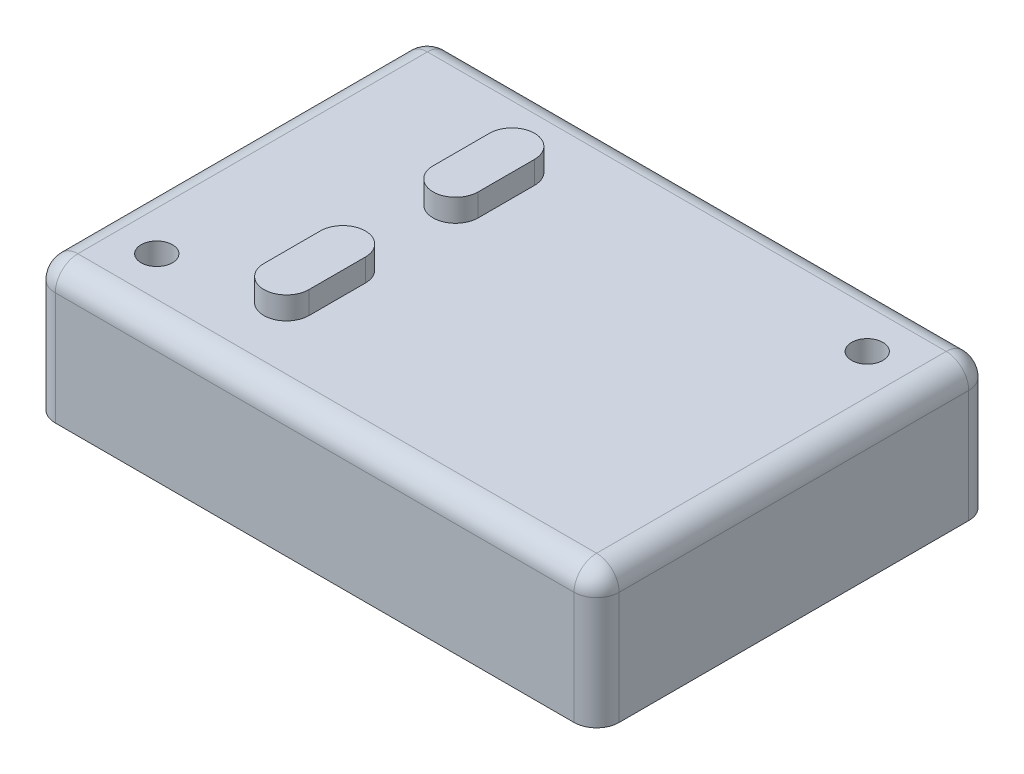
ISO-10303-21;
HEADER;
FILE_DESCRIPTION(('STEP AP214'),'2;1');
FILE_NAME('part.step','',(''),(''),'','','');
FILE_SCHEMA(('AUTOMOTIVE_DESIGN { 1 0 10303 214 1 1 1 1 }'));
ENDSEC;
DATA;
#1=APPLICATION_CONTEXT('core data for automotive mechanical design processes');
#2=APPLICATION_PROTOCOL_DEFINITION('international standard','automotive_design',2000,#1);
#3=PRODUCT_CONTEXT('',#1,'mechanical');
#4=PRODUCT('Part','Part','',(#3));
#5=PRODUCT_RELATED_PRODUCT_CATEGORY('part','',(#4));
#6=PRODUCT_DEFINITION_FORMATION('','',#4);
#7=PRODUCT_DEFINITION_CONTEXT('part definition',#1,'design');
#8=PRODUCT_DEFINITION('design','',#6,#7);
#9=PRODUCT_DEFINITION_SHAPE('','',#8);
#10=(LENGTH_UNIT() NAMED_UNIT(*) SI_UNIT(.MILLI.,.METRE.));
#11=(NAMED_UNIT(*) PLANE_ANGLE_UNIT() SI_UNIT($,.RADIAN.));
#12=(NAMED_UNIT(*) SI_UNIT($,.STERADIAN.) SOLID_ANGLE_UNIT());
#13=UNCERTAINTY_MEASURE_WITH_UNIT(LENGTH_MEASURE(1.E-05),#10,'distance_accuracy_value','');
#14=(GEOMETRIC_REPRESENTATION_CONTEXT(3) GLOBAL_UNCERTAINTY_ASSIGNED_CONTEXT((#13)) GLOBAL_UNIT_ASSIGNED_CONTEXT((#10,
#11,#12)) REPRESENTATION_CONTEXT('',''));
#15=CARTESIAN_POINT('',(0.,0.,0.));
#16=DIRECTION('',(0.,0.,1.));
#17=DIRECTION('',(1.,0.,0.));
#18=AXIS2_PLACEMENT_3D('',#15,#16,#17);
#19=CARTESIAN_POINT('',(0.,12.,0.));
#20=DIRECTION('',(0.,-1.,0.));
#21=DIRECTION('',(0.,0.,-1.));
#22=AXIS2_PLACEMENT_3D('',#19,#20,#21);
#23=PLANE('',#22);
#24=CARTESIAN_POINT('',(19.5,12.,-12.));
#25=DIRECTION('',(0.,-1.,0.));
#26=DIRECTION('',(0.,0.,-1.));
#27=AXIS2_PLACEMENT_3D('',#24,#25,#26);
#28=CIRCLE('',#27,1.39);
#29=CARTESIAN_POINT('',(19.5,12.,-13.39));
#30=VERTEX_POINT('',#29);
#31=EDGE_CURVE('E484',#30,#30,#28,.T.);
#32=ORIENTED_EDGE('',*,*,#31,.T.);
#33=EDGE_LOOP('',(#32));
#34=FACE_BOUND('',#33,.T.);
#35=CARTESIAN_POINT('',(-19.5,12.,12.));
#36=DIRECTION('',(0.,-1.,0.));
#37=DIRECTION('',(0.,0.,-1.));
#38=AXIS2_PLACEMENT_3D('',#35,#36,#37);
#39=CIRCLE('',#38,1.39);
#40=CARTESIAN_POINT('',(-19.5,12.,10.61));
#41=VERTEX_POINT('',#40);
#42=EDGE_CURVE('E278',#41,#41,#39,.T.);
#43=ORIENTED_EDGE('',*,*,#42,.T.);
#44=EDGE_LOOP('',(#43));
#45=FACE_BOUND('',#44,.T.);
#46=DIRECTION('',(-1.,0.,0.));
#47=VECTOR('',#46,1.);
#48=CARTESIAN_POINT('',(0.,12.,-15.5));
#49=LINE('',#48,#47);
#50=CARTESIAN_POINT('',(23.,12.,-15.5));
#51=VERTEX_POINT('',#50);
#52=CARTESIAN_POINT('',(-23.,12.,-15.5));
#53=VERTEX_POINT('',#52);
#54=EDGE_CURVE('E58',#51,#53,#49,.T.);
#55=ORIENTED_EDGE('',*,*,#54,.T.);
#56=DIRECTION('',(0.,0.,1.));
#57=VECTOR('',#56,1.);
#58=CARTESIAN_POINT('',(-23.,12.,0.));
#59=LINE('',#58,#57);
#60=CARTESIAN_POINT('',(-23.,12.,15.5));
#61=VERTEX_POINT('',#60);
#62=EDGE_CURVE('E11',#53,#61,#59,.T.);
#63=ORIENTED_EDGE('',*,*,#62,.T.);
#64=DIRECTION('',(1.,0.,0.));
#65=VECTOR('',#64,1.);
#66=CARTESIAN_POINT('',(0.,12.,15.5));
#67=LINE('',#66,#65);
#68=CARTESIAN_POINT('',(23.,12.,15.5));
#69=VERTEX_POINT('',#68);
#70=EDGE_CURVE('E44',#61,#69,#67,.T.);
#71=ORIENTED_EDGE('',*,*,#70,.T.);
#72=DIRECTION('',(0.,0.,-1.));
#73=VECTOR('',#72,1.);
#74=CARTESIAN_POINT('',(23.,12.,0.));
#75=LINE('',#74,#73);
#76=EDGE_CURVE('E270',#69,#51,#75,.T.);
#77=ORIENTED_EDGE('',*,*,#76,.T.);
#78=EDGE_LOOP('',(#55,#63,#71,#77));
#79=FACE_BOUND('',#78,.T.);
#80=CARTESIAN_POINT('',(-10.,12.,-10.));
#81=DIRECTION('',(0.,1.,0.));
#82=DIRECTION('',(0.,0.,1.));
#83=AXIS2_PLACEMENT_3D('',#80,#81,#82);
#84=CIRCLE('',#83,2.);
#85=CARTESIAN_POINT('',(-8.,12.,-10.));
#86=VERTEX_POINT('',#85);
#87=CARTESIAN_POINT('',(-12.,12.,-10.));
#88=VERTEX_POINT('',#87);
#89=EDGE_CURVE('E187',#86,#88,#84,.T.);
#90=ORIENTED_EDGE('',*,*,#89,.F.);
#91=DIRECTION('',(0.,0.,-1.));
#92=VECTOR('',#91,1.);
#93=CARTESIAN_POINT('',(-8.,12.,-10.));
#94=LINE('',#93,#92);
#95=CARTESIAN_POINT('',(-8.,12.,-5.));
#96=VERTEX_POINT('',#95);
#97=EDGE_CURVE('E200',#96,#86,#94,.T.);
#98=ORIENTED_EDGE('',*,*,#97,.F.);
#99=CARTESIAN_POINT('',(-10.,12.,-5.));
#100=DIRECTION('',(0.,1.,0.));
#101=DIRECTION('',(0.,0.,1.));
#102=AXIS2_PLACEMENT_3D('',#99,#100,#101);
#103=CIRCLE('',#102,2.);
#104=CARTESIAN_POINT('',(-12.,12.,-5.));
#105=VERTEX_POINT('',#104);
#106=EDGE_CURVE('E209',#105,#96,#103,.T.);
#107=ORIENTED_EDGE('',*,*,#106,.F.);
#108=DIRECTION('',(0.,0.,1.));
#109=VECTOR('',#108,1.);
#110=CARTESIAN_POINT('',(-12.,12.,-10.));
#111=LINE('',#110,#109);
#112=EDGE_CURVE('E190',#88,#105,#111,.T.);
#113=ORIENTED_EDGE('',*,*,#112,.F.);
#114=EDGE_LOOP('',(#90,#98,#107,#113));
#115=FACE_BOUND('',#114,.T.);
#116=CARTESIAN_POINT('',(-10.,12.,5.));
#117=DIRECTION('',(0.,1.,0.));
#118=DIRECTION('',(0.,0.,1.));
#119=AXIS2_PLACEMENT_3D('',#116,#117,#118);
#120=CIRCLE('',#119,2.);
#121=CARTESIAN_POINT('',(-8.,12.,5.));
#122=VERTEX_POINT('',#121);
#123=CARTESIAN_POINT('',(-12.,12.,5.));
#124=VERTEX_POINT('',#123);
#125=EDGE_CURVE('E186',#122,#124,#120,.T.);
#126=ORIENTED_EDGE('',*,*,#125,.F.);
#127=DIRECTION('',(0.,0.,-1.));
#128=VECTOR('',#127,1.);
#129=CARTESIAN_POINT('',(-8.,12.,5.));
#130=LINE('',#129,#128);
#131=CARTESIAN_POINT('',(-8.,12.,10.));
#132=VERTEX_POINT('',#131);
#133=EDGE_CURVE('E183',#132,#122,#130,.T.);
#134=ORIENTED_EDGE('',*,*,#133,.F.);
#135=CARTESIAN_POINT('',(-10.,12.,10.));
#136=DIRECTION('',(0.,1.,0.));
#137=DIRECTION('',(0.,0.,1.));
#138=AXIS2_PLACEMENT_3D('',#135,#136,#137);
#139=CIRCLE('',#138,2.);
#140=CARTESIAN_POINT('',(-12.,12.,10.));
#141=VERTEX_POINT('',#140);
#142=EDGE_CURVE('E314',#141,#132,#139,.T.);
#143=ORIENTED_EDGE('',*,*,#142,.F.);
#144=DIRECTION('',(0.,0.,1.));
#145=VECTOR('',#144,1.);
#146=CARTESIAN_POINT('',(-12.,12.,5.));
#147=LINE('',#146,#145);
#148=EDGE_CURVE('E312',#124,#141,#147,.T.);
#149=ORIENTED_EDGE('',*,*,#148,.F.);
#150=EDGE_LOOP('',(#126,#134,#143,#149));
#151=FACE_BOUND('',#150,.T.);
#152=ADVANCED_FACE('F35',(#34,#45,#79,#115,#151),#23,.F.);
#153=CARTESIAN_POINT('',(25.,12.,17.5));
#154=DIRECTION('',(-1.,0.,0.));
#155=DIRECTION('',(0.,0.,1.));
#156=AXIS2_PLACEMENT_3D('',#153,#154,#155);
#157=PLANE('',#156);
#158=DIRECTION('',(0.,0.,-1.));
#159=VECTOR('',#158,1.);
#160=CARTESIAN_POINT('',(25.,10.,17.5));
#161=LINE('',#160,#159);
#162=CARTESIAN_POINT('',(25.,10.,-15.5));
#163=VERTEX_POINT('',#162);
#164=CARTESIAN_POINT('',(25.,10.,15.5));
#165=VERTEX_POINT('',#164);
#166=EDGE_CURVE('E237',#163,#165,#161,.F.);
#167=ORIENTED_EDGE('',*,*,#166,.T.);
#168=DIRECTION('',(0.,-1.,0.));
#169=VECTOR('',#168,1.);
#170=CARTESIAN_POINT('',(25.,12.,15.5));
#171=LINE('',#170,#169);
#172=CARTESIAN_POINT('',(25.,0.,15.5));
#173=VERTEX_POINT('',#172);
#174=EDGE_CURVE('E241',#165,#173,#171,.T.);
#175=ORIENTED_EDGE('',*,*,#174,.T.);
#176=DIRECTION('',(0.,0.,-1.));
#177=VECTOR('',#176,1.);
#178=CARTESIAN_POINT('',(25.,0.,17.5));
#179=LINE('',#178,#177);
#180=CARTESIAN_POINT('',(25.,0.,-15.5));
#181=VERTEX_POINT('',#180);
#182=EDGE_CURVE('E225',#173,#181,#179,.T.);
#183=ORIENTED_EDGE('',*,*,#182,.T.);
#184=DIRECTION('',(0.,-1.,0.));
#185=VECTOR('',#184,1.);
#186=CARTESIAN_POINT('',(25.,12.,-15.5));
#187=LINE('',#186,#185);
#188=EDGE_CURVE('E239',#181,#163,#187,.F.);
#189=ORIENTED_EDGE('',*,*,#188,.T.);
#190=EDGE_LOOP('',(#167,#175,#183,#189));
#191=FACE_BOUND('',#190,.T.);
#192=ADVANCED_FACE('F332',(#191),#157,.F.);
#193=CARTESIAN_POINT('',(-25.,12.,-17.5));
#194=DIRECTION('',(0.,0.,1.));
#195=DIRECTION('',(1.,0.,0.));
#196=AXIS2_PLACEMENT_3D('',#193,#194,#195);
#197=PLANE('',#196);
#198=DIRECTION('',(-1.,0.,0.));
#199=VECTOR('',#198,1.);
#200=CARTESIAN_POINT('',(-25.,10.,-17.5));
#201=LINE('',#200,#199);
#202=CARTESIAN_POINT('',(-23.,10.,-17.5));
#203=VERTEX_POINT('',#202);
#204=CARTESIAN_POINT('',(23.,10.,-17.5));
#205=VERTEX_POINT('',#204);
#206=EDGE_CURVE('E264',#203,#205,#201,.F.);
#207=ORIENTED_EDGE('',*,*,#206,.T.);
#208=DIRECTION('',(0.,-1.,0.));
#209=VECTOR('',#208,1.);
#210=CARTESIAN_POINT('',(23.,12.,-17.5));
#211=LINE('',#210,#209);
#212=CARTESIAN_POINT('',(23.,0.,-17.5));
#213=VERTEX_POINT('',#212);
#214=EDGE_CURVE('E268',#205,#213,#211,.T.);
#215=ORIENTED_EDGE('',*,*,#214,.T.);
#216=DIRECTION('',(-1.,0.,0.));
#217=VECTOR('',#216,1.);
#218=CARTESIAN_POINT('',(-25.,0.,-17.5));
#219=LINE('',#218,#217);
#220=CARTESIAN_POINT('',(-23.,0.,-17.5));
#221=VERTEX_POINT('',#220);
#222=EDGE_CURVE('E228',#213,#221,#219,.T.);
#223=ORIENTED_EDGE('',*,*,#222,.T.);
#224=DIRECTION('',(0.,-1.,0.));
#225=VECTOR('',#224,1.);
#226=CARTESIAN_POINT('',(-23.,12.,-17.5));
#227=LINE('',#226,#225);
#228=EDGE_CURVE('E266',#221,#203,#227,.F.);
#229=ORIENTED_EDGE('',*,*,#228,.T.);
#230=EDGE_LOOP('',(#207,#215,#223,#229));
#231=FACE_BOUND('',#230,.T.);
#232=ADVANCED_FACE('F338',(#231),#197,.F.);
#233=CARTESIAN_POINT('',(-25.,12.,17.5));
#234=DIRECTION('',(1.,0.,0.));
#235=DIRECTION('',(0.,0.,-1.));
#236=AXIS2_PLACEMENT_3D('',#233,#234,#235);
#237=PLANE('',#236);
#238=DIRECTION('',(0.,0.,1.));
#239=VECTOR('',#238,1.);
#240=CARTESIAN_POINT('',(-25.,0.,17.5));
#241=LINE('',#240,#239);
#242=CARTESIAN_POINT('',(-25.,0.,-15.5));
#243=VERTEX_POINT('',#242);
#244=CARTESIAN_POINT('',(-25.,0.,15.5));
#245=VERTEX_POINT('',#244);
#246=EDGE_CURVE('E231',#243,#245,#241,.T.);
#247=ORIENTED_EDGE('',*,*,#246,.T.);
#248=DIRECTION('',(0.,-1.,0.));
#249=VECTOR('',#248,1.);
#250=CARTESIAN_POINT('',(-25.,12.,15.5));
#251=LINE('',#250,#249);
#252=CARTESIAN_POINT('',(-25.,10.,15.5));
#253=VERTEX_POINT('',#252);
#254=EDGE_CURVE('E262',#245,#253,#251,.F.);
#255=ORIENTED_EDGE('',*,*,#254,.T.);
#256=DIRECTION('',(0.,0.,1.));
#257=VECTOR('',#256,1.);
#258=CARTESIAN_POINT('',(-25.,10.,17.5));
#259=LINE('',#258,#257);
#260=CARTESIAN_POINT('',(-25.,10.,-15.5));
#261=VERTEX_POINT('',#260);
#262=EDGE_CURVE('E258',#253,#261,#259,.F.);
#263=ORIENTED_EDGE('',*,*,#262,.T.);
#264=DIRECTION('',(0.,-1.,0.));
#265=VECTOR('',#264,1.);
#266=CARTESIAN_POINT('',(-25.,12.,-15.5));
#267=LINE('',#266,#265);
#268=EDGE_CURVE('E260',#261,#243,#267,.T.);
#269=ORIENTED_EDGE('',*,*,#268,.T.);
#270=EDGE_LOOP('',(#247,#255,#263,#269));
#271=FACE_BOUND('',#270,.T.);
#272=ADVANCED_FACE('F354',(#271),#237,.F.);
#273=CARTESIAN_POINT('',(-25.,12.,17.5));
#274=DIRECTION('',(0.,0.,-1.));
#275=DIRECTION('',(-1.,0.,0.));
#276=AXIS2_PLACEMENT_3D('',#273,#274,#275);
#277=PLANE('',#276);
#278=DIRECTION('',(1.,0.,0.));
#279=VECTOR('',#278,1.);
#280=CARTESIAN_POINT('',(-25.,0.,17.5));
#281=LINE('',#280,#279);
#282=CARTESIAN_POINT('',(-23.,0.,17.5));
#283=VERTEX_POINT('',#282);
#284=CARTESIAN_POINT('',(23.,0.,17.5));
#285=VERTEX_POINT('',#284);
#286=EDGE_CURVE('E234',#283,#285,#281,.T.);
#287=ORIENTED_EDGE('',*,*,#286,.T.);
#288=DIRECTION('',(0.,-1.,0.));
#289=VECTOR('',#288,1.);
#290=CARTESIAN_POINT('',(23.,12.,17.5));
#291=LINE('',#290,#289);
#292=CARTESIAN_POINT('',(23.,10.,17.5));
#293=VERTEX_POINT('',#292);
#294=EDGE_CURVE('E256',#285,#293,#291,.F.);
#295=ORIENTED_EDGE('',*,*,#294,.T.);
#296=DIRECTION('',(1.,0.,0.));
#297=VECTOR('',#296,1.);
#298=CARTESIAN_POINT('',(-25.,10.,17.5));
#299=LINE('',#298,#297);
#300=CARTESIAN_POINT('',(-23.,10.,17.5));
#301=VERTEX_POINT('',#300);
#302=EDGE_CURVE('E252',#293,#301,#299,.F.);
#303=ORIENTED_EDGE('',*,*,#302,.T.);
#304=DIRECTION('',(0.,-1.,0.));
#305=VECTOR('',#304,1.);
#306=CARTESIAN_POINT('',(-23.,12.,17.5));
#307=LINE('',#306,#305);
#308=EDGE_CURVE('E254',#301,#283,#307,.T.);
#309=ORIENTED_EDGE('',*,*,#308,.T.);
#310=EDGE_LOOP('',(#287,#295,#303,#309));
#311=FACE_BOUND('',#310,.T.);
#312=ADVANCED_FACE('F350',(#311),#277,.F.);
#313=CARTESIAN_POINT('',(0.,0.,0.));
#314=DIRECTION('',(0.,-1.,0.));
#315=DIRECTION('',(0.,0.,-1.));
#316=AXIS2_PLACEMENT_3D('',#313,#314,#315);
#317=PLANE('',#316);
#318=CARTESIAN_POINT('',(19.5,0.,-12.));
#319=DIRECTION('',(0.,-1.,0.));
#320=DIRECTION('',(0.,0.,-1.));
#321=AXIS2_PLACEMENT_3D('',#318,#319,#320);
#322=CIRCLE('',#321,1.39);
#323=CARTESIAN_POINT('',(19.5,0.,-13.39));
#324=VERTEX_POINT('',#323);
#325=EDGE_CURVE('E482',#324,#324,#322,.T.);
#326=ORIENTED_EDGE('',*,*,#325,.F.);
#327=EDGE_LOOP('',(#326));
#328=FACE_BOUND('',#327,.T.);
#329=CARTESIAN_POINT('',(-19.5,0.,12.));
#330=DIRECTION('',(0.,-1.,0.));
#331=DIRECTION('',(0.,0.,-1.));
#332=AXIS2_PLACEMENT_3D('',#329,#330,#331);
#333=CIRCLE('',#332,1.39);
#334=CARTESIAN_POINT('',(-19.5,0.,10.61));
#335=VERTEX_POINT('',#334);
#336=EDGE_CURVE('E485',#335,#335,#333,.T.);
#337=ORIENTED_EDGE('',*,*,#336,.F.);
#338=EDGE_LOOP('',(#337));
#339=FACE_BOUND('',#338,.T.);
#340=ORIENTED_EDGE('',*,*,#182,.F.);
#341=CARTESIAN_POINT('',(23.,0.,15.5));
#342=DIRECTION('',(0.,-1.,0.));
#343=DIRECTION('',(0.,0.,-1.));
#344=AXIS2_PLACEMENT_3D('',#341,#342,#343);
#345=CIRCLE('',#344,2.);
#346=EDGE_CURVE('E250',#173,#285,#345,.T.);
#347=ORIENTED_EDGE('',*,*,#346,.T.);
#348=ORIENTED_EDGE('',*,*,#286,.F.);
#349=CARTESIAN_POINT('',(-23.,0.,15.5));
#350=DIRECTION('',(0.,-1.,0.));
#351=DIRECTION('',(0.,0.,-1.));
#352=AXIS2_PLACEMENT_3D('',#349,#350,#351);
#353=CIRCLE('',#352,2.);
#354=EDGE_CURVE('E248',#283,#245,#353,.T.);
#355=ORIENTED_EDGE('',*,*,#354,.T.);
#356=ORIENTED_EDGE('',*,*,#246,.F.);
#357=CARTESIAN_POINT('',(-23.,0.,-15.5));
#358=DIRECTION('',(0.,-1.,0.));
#359=DIRECTION('',(0.,0.,-1.));
#360=AXIS2_PLACEMENT_3D('',#357,#358,#359);
#361=CIRCLE('',#360,2.);
#362=EDGE_CURVE('E244',#243,#221,#361,.T.);
#363=ORIENTED_EDGE('',*,*,#362,.T.);
#364=ORIENTED_EDGE('',*,*,#222,.F.);
#365=CARTESIAN_POINT('',(23.,0.,-15.5));
#366=DIRECTION('',(0.,-1.,0.));
#367=DIRECTION('',(0.,0.,-1.));
#368=AXIS2_PLACEMENT_3D('',#365,#366,#367);
#369=CIRCLE('',#368,2.);
#370=EDGE_CURVE('E246',#213,#181,#369,.T.);
#371=ORIENTED_EDGE('',*,*,#370,.T.);
#372=EDGE_LOOP('',(#340,#347,#348,#355,#356,#363,#364,#371));
#373=FACE_BOUND('',#372,.T.);
#374=ADVANCED_FACE('F347',(#328,#339,#373),#317,.T.);
#375=CARTESIAN_POINT('',(-10.,14.,-10.));
#376=DIRECTION('',(0.,-1.,0.));
#377=DIRECTION('',(0.,0.,-1.));
#378=AXIS2_PLACEMENT_3D('',#375,#376,#377);
#379=CYLINDRICAL_SURFACE('',#378,2.);
#380=ORIENTED_EDGE('',*,*,#89,.T.);
#381=DIRECTION('',(0.,-1.,0.));
#382=VECTOR('',#381,1.);
#383=CARTESIAN_POINT('',(-12.,14.,-10.));
#384=LINE('',#383,#382);
#385=CARTESIAN_POINT('',(-12.,14.,-10.));
#386=VERTEX_POINT('',#385);
#387=EDGE_CURVE('E222',#386,#88,#384,.T.);
#388=ORIENTED_EDGE('',*,*,#387,.F.);
#389=CARTESIAN_POINT('',(-10.,14.,-10.));
#390=DIRECTION('',(0.,1.,0.));
#391=DIRECTION('',(0.,0.,1.));
#392=AXIS2_PLACEMENT_3D('',#389,#390,#391);
#393=CIRCLE('',#392,2.);
#394=CARTESIAN_POINT('',(-8.,14.,-10.));
#395=VERTEX_POINT('',#394);
#396=EDGE_CURVE('E196',#395,#386,#393,.T.);
#397=ORIENTED_EDGE('',*,*,#396,.F.);
#398=DIRECTION('',(0.,-1.,0.));
#399=VECTOR('',#398,1.);
#400=CARTESIAN_POINT('',(-8.,14.,-10.));
#401=LINE('',#400,#399);
#402=EDGE_CURVE('E205',#395,#86,#401,.T.);
#403=ORIENTED_EDGE('',*,*,#402,.T.);
#404=EDGE_LOOP('',(#380,#388,#397,#403));
#405=FACE_BOUND('',#404,.T.);
#406=ADVANCED_FACE('F345',(#405),#379,.T.);
#407=CARTESIAN_POINT('',(-12.,14.,-10.));
#408=DIRECTION('',(1.,0.,0.));
#409=DIRECTION('',(0.,0.,-1.));
#410=AXIS2_PLACEMENT_3D('',#407,#408,#409);
#411=PLANE('',#410);
#412=ORIENTED_EDGE('',*,*,#112,.T.);
#413=DIRECTION('',(0.,-1.,0.));
#414=VECTOR('',#413,1.);
#415=CARTESIAN_POINT('',(-12.,14.,-5.));
#416=LINE('',#415,#414);
#417=CARTESIAN_POINT('',(-12.,14.,-5.));
#418=VERTEX_POINT('',#417);
#419=EDGE_CURVE('E219',#418,#105,#416,.T.);
#420=ORIENTED_EDGE('',*,*,#419,.F.);
#421=DIRECTION('',(0.,0.,1.));
#422=VECTOR('',#421,1.);
#423=CARTESIAN_POINT('',(-12.,14.,-10.));
#424=LINE('',#423,#422);
#425=EDGE_CURVE('E199',#386,#418,#424,.T.);
#426=ORIENTED_EDGE('',*,*,#425,.F.);
#427=ORIENTED_EDGE('',*,*,#387,.T.);
#428=EDGE_LOOP('',(#412,#420,#426,#427));
#429=FACE_BOUND('',#428,.T.);
#430=ADVANCED_FACE('F449',(#429),#411,.F.);
#431=CARTESIAN_POINT('',(-10.,14.,-5.));
#432=DIRECTION('',(0.,-1.,0.));
#433=DIRECTION('',(0.,0.,-1.));
#434=AXIS2_PLACEMENT_3D('',#431,#432,#433);
#435=CYLINDRICAL_SURFACE('',#434,2.);
#436=ORIENTED_EDGE('',*,*,#106,.T.);
#437=DIRECTION('',(0.,-1.,0.));
#438=VECTOR('',#437,1.);
#439=CARTESIAN_POINT('',(-8.,14.,-5.));
#440=LINE('',#439,#438);
#441=CARTESIAN_POINT('',(-8.,14.,-5.));
#442=VERTEX_POINT('',#441);
#443=EDGE_CURVE('E216',#442,#96,#440,.T.);
#444=ORIENTED_EDGE('',*,*,#443,.F.);
#445=CARTESIAN_POINT('',(-10.,14.,-5.));
#446=DIRECTION('',(0.,1.,0.));
#447=DIRECTION('',(0.,0.,1.));
#448=AXIS2_PLACEMENT_3D('',#445,#446,#447);
#449=CIRCLE('',#448,2.);
#450=EDGE_CURVE('E202',#418,#442,#449,.T.);
#451=ORIENTED_EDGE('',*,*,#450,.F.);
#452=ORIENTED_EDGE('',*,*,#419,.T.);
#453=EDGE_LOOP('',(#436,#444,#451,#452));
#454=FACE_BOUND('',#453,.T.);
#455=ADVANCED_FACE('F447',(#454),#435,.T.);
#456=CARTESIAN_POINT('',(-8.,14.,-10.));
#457=DIRECTION('',(-1.,0.,0.));
#458=DIRECTION('',(0.,0.,1.));
#459=AXIS2_PLACEMENT_3D('',#456,#457,#458);
#460=PLANE('',#459);
#461=ORIENTED_EDGE('',*,*,#97,.T.);
#462=ORIENTED_EDGE('',*,*,#402,.F.);
#463=DIRECTION('',(0.,0.,-1.));
#464=VECTOR('',#463,1.);
#465=CARTESIAN_POINT('',(-8.,14.,-10.));
#466=LINE('',#465,#464);
#467=EDGE_CURVE('E204',#442,#395,#466,.T.);
#468=ORIENTED_EDGE('',*,*,#467,.F.);
#469=ORIENTED_EDGE('',*,*,#443,.T.);
#470=EDGE_LOOP('',(#461,#462,#468,#469));
#471=FACE_BOUND('',#470,.T.);
#472=ADVANCED_FACE('F438',(#471),#460,.F.);
#473=CARTESIAN_POINT('',(-10.,14.,-10.));
#474=DIRECTION('',(0.,1.,0.));
#475=DIRECTION('',(0.,0.,1.));
#476=AXIS2_PLACEMENT_3D('',#473,#474,#475);
#477=PLANE('',#476);
#478=ORIENTED_EDGE('',*,*,#396,.T.);
#479=ORIENTED_EDGE('',*,*,#425,.T.);
#480=ORIENTED_EDGE('',*,*,#450,.T.);
#481=ORIENTED_EDGE('',*,*,#467,.T.);
#482=EDGE_LOOP('',(#478,#479,#480,#481));
#483=FACE_BOUND('',#482,.T.);
#484=ADVANCED_FACE('F443',(#483),#477,.T.);
#485=CARTESIAN_POINT('',(-10.,14.,5.));
#486=DIRECTION('',(0.,-1.,0.));
#487=DIRECTION('',(0.,0.,-1.));
#488=AXIS2_PLACEMENT_3D('',#485,#486,#487);
#489=CYLINDRICAL_SURFACE('',#488,2.);
#490=ORIENTED_EDGE('',*,*,#125,.T.);
#491=DIRECTION('',(0.,-1.,0.));
#492=VECTOR('',#491,1.);
#493=CARTESIAN_POINT('',(-12.,14.,5.));
#494=LINE('',#493,#492);
#495=CARTESIAN_POINT('',(-12.,14.,5.));
#496=VERTEX_POINT('',#495);
#497=EDGE_CURVE('E167',#496,#124,#494,.T.);
#498=ORIENTED_EDGE('',*,*,#497,.F.);
#499=CARTESIAN_POINT('',(-10.,14.,5.));
#500=DIRECTION('',(0.,1.,0.));
#501=DIRECTION('',(0.,0.,1.));
#502=AXIS2_PLACEMENT_3D('',#499,#500,#501);
#503=CIRCLE('',#502,2.);
#504=CARTESIAN_POINT('',(-8.,14.,5.));
#505=VERTEX_POINT('',#504);
#506=EDGE_CURVE('E174',#505,#496,#503,.T.);
#507=ORIENTED_EDGE('',*,*,#506,.F.);
#508=DIRECTION('',(0.,-1.,0.));
#509=VECTOR('',#508,1.);
#510=CARTESIAN_POINT('',(-8.,14.,5.));
#511=LINE('',#510,#509);
#512=EDGE_CURVE('E323',#505,#122,#511,.T.);
#513=ORIENTED_EDGE('',*,*,#512,.T.);
#514=EDGE_LOOP('',(#490,#498,#507,#513));
#515=FACE_BOUND('',#514,.T.);
#516=ADVANCED_FACE('F185',(#515),#489,.T.);
#517=CARTESIAN_POINT('',(-12.,14.,5.));
#518=DIRECTION('',(1.,0.,0.));
#519=DIRECTION('',(0.,0.,-1.));
#520=AXIS2_PLACEMENT_3D('',#517,#518,#519);
#521=PLANE('',#520);
#522=ORIENTED_EDGE('',*,*,#148,.T.);
#523=DIRECTION('',(0.,-1.,0.));
#524=VECTOR('',#523,1.);
#525=CARTESIAN_POINT('',(-12.,14.,10.));
#526=LINE('',#525,#524);
#527=CARTESIAN_POINT('',(-12.,14.,10.));
#528=VERTEX_POINT('',#527);
#529=EDGE_CURVE('E170',#528,#141,#526,.T.);
#530=ORIENTED_EDGE('',*,*,#529,.F.);
#531=DIRECTION('',(0.,0.,1.));
#532=VECTOR('',#531,1.);
#533=CARTESIAN_POINT('',(-12.,14.,5.));
#534=LINE('',#533,#532);
#535=EDGE_CURVE('E162',#496,#528,#534,.T.);
#536=ORIENTED_EDGE('',*,*,#535,.F.);
#537=ORIENTED_EDGE('',*,*,#497,.T.);
#538=EDGE_LOOP('',(#522,#530,#536,#537));
#539=FACE_BOUND('',#538,.T.);
#540=ADVANCED_FACE('F165',(#539),#521,.F.);
#541=CARTESIAN_POINT('',(-10.,14.,10.));
#542=DIRECTION('',(0.,-1.,0.));
#543=DIRECTION('',(0.,0.,-1.));
#544=AXIS2_PLACEMENT_3D('',#541,#542,#543);
#545=CYLINDRICAL_SURFACE('',#544,2.);
#546=ORIENTED_EDGE('',*,*,#142,.T.);
#547=DIRECTION('',(0.,-1.,0.));
#548=VECTOR('',#547,1.);
#549=CARTESIAN_POINT('',(-8.,14.,10.));
#550=LINE('',#549,#548);
#551=CARTESIAN_POINT('',(-8.,14.,10.));
#552=VERTEX_POINT('',#551);
#553=EDGE_CURVE('E192',#552,#132,#550,.T.);
#554=ORIENTED_EDGE('',*,*,#553,.F.);
#555=CARTESIAN_POINT('',(-10.,14.,10.));
#556=DIRECTION('',(0.,1.,0.));
#557=DIRECTION('',(0.,0.,1.));
#558=AXIS2_PLACEMENT_3D('',#555,#556,#557);
#559=CIRCLE('',#558,2.);
#560=EDGE_CURVE('E173',#528,#552,#559,.T.);
#561=ORIENTED_EDGE('',*,*,#560,.F.);
#562=ORIENTED_EDGE('',*,*,#529,.T.);
#563=EDGE_LOOP('',(#546,#554,#561,#562));
#564=FACE_BOUND('',#563,.T.);
#565=ADVANCED_FACE('F329',(#564),#545,.T.);
#566=CARTESIAN_POINT('',(-8.,14.,5.));
#567=DIRECTION('',(-1.,0.,0.));
#568=DIRECTION('',(0.,0.,1.));
#569=AXIS2_PLACEMENT_3D('',#566,#567,#568);
#570=PLANE('',#569);
#571=ORIENTED_EDGE('',*,*,#133,.T.);
#572=ORIENTED_EDGE('',*,*,#512,.F.);
#573=DIRECTION('',(0.,0.,-1.));
#574=VECTOR('',#573,1.);
#575=CARTESIAN_POINT('',(-8.,14.,5.));
#576=LINE('',#575,#574);
#577=EDGE_CURVE('E179',#552,#505,#576,.T.);
#578=ORIENTED_EDGE('',*,*,#577,.F.);
#579=ORIENTED_EDGE('',*,*,#553,.T.);
#580=EDGE_LOOP('',(#571,#572,#578,#579));
#581=FACE_BOUND('',#580,.T.);
#582=ADVANCED_FACE('F327',(#581),#570,.F.);
#583=CARTESIAN_POINT('',(-10.,14.,5.));
#584=DIRECTION('',(0.,1.,0.));
#585=DIRECTION('',(0.,0.,1.));
#586=AXIS2_PLACEMENT_3D('',#583,#584,#585);
#587=PLANE('',#586);
#588=ORIENTED_EDGE('',*,*,#506,.T.);
#589=ORIENTED_EDGE('',*,*,#535,.T.);
#590=ORIENTED_EDGE('',*,*,#560,.T.);
#591=ORIENTED_EDGE('',*,*,#577,.T.);
#592=EDGE_LOOP('',(#588,#589,#590,#591));
#593=FACE_BOUND('',#592,.T.);
#594=ADVANCED_FACE('F177',(#593),#587,.T.);
#595=CARTESIAN_POINT('',(-23.,12.,-15.5));
#596=DIRECTION('',(0.,-1.,0.));
#597=DIRECTION('',(0.,0.,-1.));
#598=AXIS2_PLACEMENT_3D('',#595,#596,#597);
#599=CYLINDRICAL_SURFACE('',#598,2.);
#600=CARTESIAN_POINT('',(-23.,10.,-15.5));
#601=DIRECTION('',(0.,1.,0.));
#602=DIRECTION('',(0.,0.,1.));
#603=AXIS2_PLACEMENT_3D('',#600,#601,#602);
#604=CIRCLE('',#603,2.);
#605=EDGE_CURVE('E39',#203,#261,#604,.T.);
#606=ORIENTED_EDGE('',*,*,#605,.F.);
#607=ORIENTED_EDGE('',*,*,#228,.F.);
#608=ORIENTED_EDGE('',*,*,#362,.F.);
#609=ORIENTED_EDGE('',*,*,#268,.F.);
#610=EDGE_LOOP('',(#606,#607,#608,#609));
#611=FACE_BOUND('',#610,.T.);
#612=ADVANCED_FACE('F37',(#611),#599,.T.);
#613=CARTESIAN_POINT('',(-23.,10.,-15.5));
#614=DIRECTION('',(0.,0.,1.));
#615=DIRECTION('',(1.,0.,0.));
#616=AXIS2_PLACEMENT_3D('',#613,#614,#615);
#617=SPHERICAL_SURFACE('',#616,2.);
#618=CARTESIAN_POINT('',(-23.,10.,-15.5));
#619=DIRECTION('',(-1.,0.,0.));
#620=DIRECTION('',(0.,0.,1.));
#621=AXIS2_PLACEMENT_3D('',#618,#619,#620);
#622=CIRCLE('',#621,2.);
#623=EDGE_CURVE('E301',#203,#53,#622,.F.);
#624=ORIENTED_EDGE('',*,*,#623,.F.);
#625=ORIENTED_EDGE('',*,*,#605,.T.);
#626=CARTESIAN_POINT('',(-23.,10.,-15.5));
#627=DIRECTION('',(0.,0.,-1.));
#628=DIRECTION('',(0.,1.,0.));
#629=AXIS2_PLACEMENT_3D('',#626,#627,#628);
#630=CIRCLE('',#629,2.);
#631=EDGE_CURVE('E302',#53,#261,#630,.F.);
#632=ORIENTED_EDGE('',*,*,#631,.F.);
#633=EDGE_LOOP('',(#624,#625,#632));
#634=FACE_BOUND('',#633,.T.);
#635=ADVANCED_FACE('F399',(#634),#617,.T.);
#636=CARTESIAN_POINT('',(-23.,12.,15.5));
#637=DIRECTION('',(0.,-1.,0.));
#638=DIRECTION('',(0.,0.,-1.));
#639=AXIS2_PLACEMENT_3D('',#636,#637,#638);
#640=CYLINDRICAL_SURFACE('',#639,2.);
#641=ORIENTED_EDGE('',*,*,#354,.F.);
#642=ORIENTED_EDGE('',*,*,#308,.F.);
#643=CARTESIAN_POINT('',(-23.,10.,15.5));
#644=DIRECTION('',(0.,1.,0.));
#645=DIRECTION('',(0.,0.,1.));
#646=AXIS2_PLACEMENT_3D('',#643,#644,#645);
#647=CIRCLE('',#646,2.);
#648=EDGE_CURVE('E298',#253,#301,#647,.T.);
#649=ORIENTED_EDGE('',*,*,#648,.F.);
#650=ORIENTED_EDGE('',*,*,#254,.F.);
#651=EDGE_LOOP('',(#641,#642,#649,#650));
#652=FACE_BOUND('',#651,.T.);
#653=ADVANCED_FACE('F397',(#652),#640,.T.);
#654=CARTESIAN_POINT('',(-23.,10.,0.));
#655=DIRECTION('',(0.,0.,1.));
#656=DIRECTION('',(1.,0.,0.));
#657=AXIS2_PLACEMENT_3D('',#654,#655,#656);
#658=CYLINDRICAL_SURFACE('',#657,2.);
#659=ORIENTED_EDGE('',*,*,#631,.T.);
#660=ORIENTED_EDGE('',*,*,#262,.F.);
#661=CARTESIAN_POINT('',(-23.,10.,15.5));
#662=DIRECTION('',(0.,0.,1.));
#663=DIRECTION('',(1.,0.,0.));
#664=AXIS2_PLACEMENT_3D('',#661,#662,#663);
#665=CIRCLE('',#664,2.);
#666=EDGE_CURVE('E295',#61,#253,#665,.T.);
#667=ORIENTED_EDGE('',*,*,#666,.F.);
#668=ORIENTED_EDGE('',*,*,#62,.F.);
#669=EDGE_LOOP('',(#659,#660,#667,#668));
#670=FACE_BOUND('',#669,.T.);
#671=ADVANCED_FACE('F393',(#670),#658,.T.);
#672=CARTESIAN_POINT('',(0.,10.,-15.5));
#673=DIRECTION('',(-1.,0.,0.));
#674=DIRECTION('',(0.,0.,1.));
#675=AXIS2_PLACEMENT_3D('',#672,#673,#674);
#676=CYLINDRICAL_SURFACE('',#675,2.);
#677=ORIENTED_EDGE('',*,*,#623,.T.);
#678=ORIENTED_EDGE('',*,*,#54,.F.);
#679=CARTESIAN_POINT('',(23.,10.,-15.5));
#680=DIRECTION('',(1.,0.,0.));
#681=DIRECTION('',(0.,0.,-1.));
#682=AXIS2_PLACEMENT_3D('',#679,#680,#681);
#683=CIRCLE('',#682,2.);
#684=EDGE_CURVE('E292',#205,#51,#683,.T.);
#685=ORIENTED_EDGE('',*,*,#684,.F.);
#686=ORIENTED_EDGE('',*,*,#206,.F.);
#687=EDGE_LOOP('',(#677,#678,#685,#686));
#688=FACE_BOUND('',#687,.T.);
#689=ADVANCED_FACE('F389',(#688),#676,.T.);
#690=CARTESIAN_POINT('',(23.,12.,-15.5));
#691=DIRECTION('',(0.,-1.,0.));
#692=DIRECTION('',(0.,0.,-1.));
#693=AXIS2_PLACEMENT_3D('',#690,#691,#692);
#694=CYLINDRICAL_SURFACE('',#693,2.);
#695=ORIENTED_EDGE('',*,*,#370,.F.);
#696=ORIENTED_EDGE('',*,*,#214,.F.);
#697=CARTESIAN_POINT('',(23.,10.,-15.5));
#698=DIRECTION('',(0.,1.,0.));
#699=DIRECTION('',(0.,0.,1.));
#700=AXIS2_PLACEMENT_3D('',#697,#698,#699);
#701=CIRCLE('',#700,2.);
#702=EDGE_CURVE('E289',#163,#205,#701,.T.);
#703=ORIENTED_EDGE('',*,*,#702,.F.);
#704=ORIENTED_EDGE('',*,*,#188,.F.);
#705=EDGE_LOOP('',(#695,#696,#703,#704));
#706=FACE_BOUND('',#705,.T.);
#707=ADVANCED_FACE('F385',(#706),#694,.T.);
#708=CARTESIAN_POINT('',(-23.,10.,15.5));
#709=DIRECTION('',(0.,0.,1.));
#710=DIRECTION('',(1.,0.,0.));
#711=AXIS2_PLACEMENT_3D('',#708,#709,#710);
#712=SPHERICAL_SURFACE('',#711,2.);
#713=ORIENTED_EDGE('',*,*,#666,.T.);
#714=ORIENTED_EDGE('',*,*,#648,.T.);
#715=CARTESIAN_POINT('',(-23.,10.,15.5));
#716=DIRECTION('',(-1.,0.,0.));
#717=DIRECTION('',(0.,0.,1.));
#718=AXIS2_PLACEMENT_3D('',#715,#716,#717);
#719=CIRCLE('',#718,2.);
#720=EDGE_CURVE('E287',#61,#301,#719,.F.);
#721=ORIENTED_EDGE('',*,*,#720,.F.);
#722=EDGE_LOOP('',(#713,#714,#721));
#723=FACE_BOUND('',#722,.T.);
#724=ADVANCED_FACE('F381',(#723),#712,.T.);
#725=CARTESIAN_POINT('',(23.,10.,-15.5));
#726=DIRECTION('',(0.,0.,1.));
#727=DIRECTION('',(1.,0.,0.));
#728=AXIS2_PLACEMENT_3D('',#725,#726,#727);
#729=SPHERICAL_SURFACE('',#728,2.);
#730=ORIENTED_EDGE('',*,*,#702,.T.);
#731=ORIENTED_EDGE('',*,*,#684,.T.);
#732=CARTESIAN_POINT('',(23.,10.,-15.5));
#733=DIRECTION('',(0.,0.,-1.));
#734=DIRECTION('',(-1.,0.,0.));
#735=AXIS2_PLACEMENT_3D('',#732,#733,#734);
#736=CIRCLE('',#735,2.);
#737=EDGE_CURVE('E284',#163,#51,#736,.F.);
#738=ORIENTED_EDGE('',*,*,#737,.F.);
#739=EDGE_LOOP('',(#730,#731,#738));
#740=FACE_BOUND('',#739,.T.);
#741=ADVANCED_FACE('F378',(#740),#729,.T.);
#742=CARTESIAN_POINT('',(0.,10.,15.5));
#743=DIRECTION('',(1.,0.,0.));
#744=DIRECTION('',(0.,0.,-1.));
#745=AXIS2_PLACEMENT_3D('',#742,#743,#744);
#746=CYLINDRICAL_SURFACE('',#745,2.);
#747=ORIENTED_EDGE('',*,*,#720,.T.);
#748=ORIENTED_EDGE('',*,*,#302,.F.);
#749=CARTESIAN_POINT('',(23.,10.,15.5));
#750=DIRECTION('',(1.,0.,0.));
#751=DIRECTION('',(0.,0.,-1.));
#752=AXIS2_PLACEMENT_3D('',#749,#750,#751);
#753=CIRCLE('',#752,2.);
#754=EDGE_CURVE('E281',#69,#293,#753,.T.);
#755=ORIENTED_EDGE('',*,*,#754,.F.);
#756=ORIENTED_EDGE('',*,*,#70,.F.);
#757=EDGE_LOOP('',(#747,#748,#755,#756));
#758=FACE_BOUND('',#757,.T.);
#759=ADVANCED_FACE('F374',(#758),#746,.T.);
#760=CARTESIAN_POINT('',(23.,10.,0.));
#761=DIRECTION('',(0.,0.,-1.));
#762=DIRECTION('',(-1.,0.,0.));
#763=AXIS2_PLACEMENT_3D('',#760,#761,#762);
#764=CYLINDRICAL_SURFACE('',#763,2.);
#765=ORIENTED_EDGE('',*,*,#737,.T.);
#766=ORIENTED_EDGE('',*,*,#76,.F.);
#767=CARTESIAN_POINT('',(23.,10.,15.5));
#768=DIRECTION('',(0.,0.,1.));
#769=DIRECTION('',(1.,0.,0.));
#770=AXIS2_PLACEMENT_3D('',#767,#768,#769);
#771=CIRCLE('',#770,2.);
#772=EDGE_CURVE('E277',#165,#69,#771,.T.);
#773=ORIENTED_EDGE('',*,*,#772,.F.);
#774=ORIENTED_EDGE('',*,*,#166,.F.);
#775=EDGE_LOOP('',(#765,#766,#773,#774));
#776=FACE_BOUND('',#775,.T.);
#777=ADVANCED_FACE('F370',(#776),#764,.T.);
#778=CARTESIAN_POINT('',(23.,10.,15.5));
#779=DIRECTION('',(0.,0.,1.));
#780=DIRECTION('',(1.,0.,0.));
#781=AXIS2_PLACEMENT_3D('',#778,#779,#780);
#782=SPHERICAL_SURFACE('',#781,2.);
#783=ORIENTED_EDGE('',*,*,#772,.T.);
#784=ORIENTED_EDGE('',*,*,#754,.T.);
#785=CARTESIAN_POINT('',(23.,10.,15.5));
#786=DIRECTION('',(0.,1.,0.));
#787=DIRECTION('',(0.,0.,1.));
#788=AXIS2_PLACEMENT_3D('',#785,#786,#787);
#789=CIRCLE('',#788,2.);
#790=EDGE_CURVE('E274',#165,#293,#789,.F.);
#791=ORIENTED_EDGE('',*,*,#790,.F.);
#792=EDGE_LOOP('',(#783,#784,#791));
#793=FACE_BOUND('',#792,.T.);
#794=ADVANCED_FACE('F366',(#793),#782,.T.);
#795=CARTESIAN_POINT('',(23.,12.,15.5));
#796=DIRECTION('',(0.,-1.,0.));
#797=DIRECTION('',(0.,0.,-1.));
#798=AXIS2_PLACEMENT_3D('',#795,#796,#797);
#799=CYLINDRICAL_SURFACE('',#798,2.);
#800=ORIENTED_EDGE('',*,*,#790,.T.);
#801=ORIENTED_EDGE('',*,*,#294,.F.);
#802=ORIENTED_EDGE('',*,*,#346,.F.);
#803=ORIENTED_EDGE('',*,*,#174,.F.);
#804=EDGE_LOOP('',(#800,#801,#802,#803));
#805=FACE_BOUND('',#804,.T.);
#806=ADVANCED_FACE('F362',(#805),#799,.T.);
#807=CARTESIAN_POINT('',(-19.5,14.,12.));
#808=DIRECTION('',(0.,-1.,0.));
#809=DIRECTION('',(0.,0.,-1.));
#810=AXIS2_PLACEMENT_3D('',#807,#808,#809);
#811=CYLINDRICAL_SURFACE('',#810,1.39);
#812=ORIENTED_EDGE('',*,*,#336,.T.);
#813=EDGE_LOOP('',(#812));
#814=FACE_BOUND('',#813,.T.);
#815=ORIENTED_EDGE('',*,*,#42,.F.);
#816=EDGE_LOOP('',(#815));
#817=FACE_BOUND('',#816,.T.);
#818=ADVANCED_FACE('F365',(#814,#817),#811,.F.);
#819=CARTESIAN_POINT('',(19.5,14.,-12.));
#820=DIRECTION('',(0.,-1.,0.));
#821=DIRECTION('',(0.,0.,-1.));
#822=AXIS2_PLACEMENT_3D('',#819,#820,#821);
#823=CYLINDRICAL_SURFACE('',#822,1.39);
#824=ORIENTED_EDGE('',*,*,#325,.T.);
#825=EDGE_LOOP('',(#824));
#826=FACE_BOUND('',#825,.T.);
#827=ORIENTED_EDGE('',*,*,#31,.F.);
#828=EDGE_LOOP('',(#827));
#829=FACE_BOUND('',#828,.T.);
#830=ADVANCED_FACE('F473',(#826,#829),#823,.F.);
#831=CLOSED_SHELL('',(#152,#192,#232,#272,#312,#374,#406,#430,#455,#472,#484,#516,#540,#565,
#582,#594,#612,#635,#653,#671,#689,#707,#724,#741,#759,#777,#794,#806,#818,#830));
#832=MANIFOLD_SOLID_BREP('B2',#831);
#833=ADVANCED_BREP_SHAPE_REPRESENTATION('',(#18,#832),#14);
#834=SHAPE_DEFINITION_REPRESENTATION(#9,#833);
ENDSEC;
END-ISO-10303-21;
